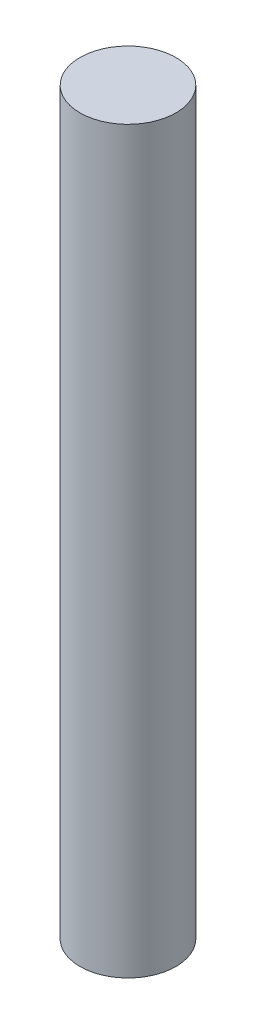
ISO-10303-21;
HEADER;
FILE_DESCRIPTION(('STEP AP214'),'2;1');
FILE_NAME('part.step','',(''),(''),'','','');
FILE_SCHEMA(('AUTOMOTIVE_DESIGN { 1 0 10303 214 1 1 1 1 }'));
ENDSEC;
DATA;
#1=APPLICATION_CONTEXT('core data for automotive mechanical design processes');
#2=APPLICATION_PROTOCOL_DEFINITION('international standard','automotive_design',2000,#1);
#3=PRODUCT_CONTEXT('',#1,'mechanical');
#4=PRODUCT('Part','Part','',(#3));
#5=PRODUCT_RELATED_PRODUCT_CATEGORY('part','',(#4));
#6=PRODUCT_DEFINITION_FORMATION('','',#4);
#7=PRODUCT_DEFINITION_CONTEXT('part definition',#1,'design');
#8=PRODUCT_DEFINITION('design','',#6,#7);
#9=PRODUCT_DEFINITION_SHAPE('','',#8);
#10=(LENGTH_UNIT() NAMED_UNIT(*) SI_UNIT(.MILLI.,.METRE.));
#11=(NAMED_UNIT(*) PLANE_ANGLE_UNIT() SI_UNIT($,.RADIAN.));
#12=(NAMED_UNIT(*) SI_UNIT($,.STERADIAN.) SOLID_ANGLE_UNIT());
#13=UNCERTAINTY_MEASURE_WITH_UNIT(LENGTH_MEASURE(1.E-05),#10,'distance_accuracy_value','');
#14=(GEOMETRIC_REPRESENTATION_CONTEXT(3) GLOBAL_UNCERTAINTY_ASSIGNED_CONTEXT((#13)) GLOBAL_UNIT_ASSIGNED_CONTEXT((#10,
#11,#12)) REPRESENTATION_CONTEXT('',''));
#15=CARTESIAN_POINT('',(0.,0.,0.));
#16=DIRECTION('',(0.,0.,1.));
#17=DIRECTION('',(1.,0.,0.));
#18=AXIS2_PLACEMENT_3D('',#15,#16,#17);
#19=CARTESIAN_POINT('',(0.,73.2,0.));
#20=DIRECTION('',(0.,-1.,0.));
#21=DIRECTION('',(0.,0.,-1.));
#22=AXIS2_PLACEMENT_3D('',#19,#20,#21);
#23=CYLINDRICAL_SURFACE('',#22,4.75);
#24=CARTESIAN_POINT('',(0.,73.2,0.));
#25=DIRECTION('',(0.,1.,0.));
#26=DIRECTION('',(0.,0.,1.));
#27=AXIS2_PLACEMENT_3D('',#24,#25,#26);
#28=CIRCLE('',#27,4.75);
#29=CARTESIAN_POINT('',(0.,73.2,4.75));
#30=VERTEX_POINT('',#29);
#31=EDGE_CURVE('E10',#30,#30,#28,.T.);
#32=ORIENTED_EDGE('',*,*,#31,.F.);
#33=EDGE_LOOP('',(#32));
#34=FACE_BOUND('',#33,.T.);
#35=CARTESIAN_POINT('',(0.,0.,0.));
#36=DIRECTION('',(0.,1.,0.));
#37=DIRECTION('',(0.,0.,1.));
#38=AXIS2_PLACEMENT_3D('',#35,#36,#37);
#39=CIRCLE('',#38,4.75);
#40=CARTESIAN_POINT('',(0.,0.,4.75));
#41=VERTEX_POINT('',#40);
#42=EDGE_CURVE('E33',#41,#41,#39,.T.);
#43=ORIENTED_EDGE('',*,*,#42,.T.);
#44=EDGE_LOOP('',(#43));
#45=FACE_BOUND('',#44,.T.);
#46=ADVANCED_FACE('F30',(#34,#45),#23,.T.);
#47=CARTESIAN_POINT('',(0.,73.2,0.));
#48=DIRECTION('',(0.,1.,0.));
#49=DIRECTION('',(0.,0.,1.));
#50=AXIS2_PLACEMENT_3D('',#47,#48,#49);
#51=PLANE('',#50);
#52=ORIENTED_EDGE('',*,*,#31,.T.);
#53=EDGE_LOOP('',(#52));
#54=FACE_BOUND('',#53,.T.);
#55=ADVANCED_FACE('F45',(#54),#51,.T.);
#56=CARTESIAN_POINT('',(0.,0.,0.));
#57=DIRECTION('',(0.,1.,0.));
#58=DIRECTION('',(0.,0.,1.));
#59=AXIS2_PLACEMENT_3D('',#56,#57,#58);
#60=PLANE('',#59);
#61=ORIENTED_EDGE('',*,*,#42,.F.);
#62=EDGE_LOOP('',(#61));
#63=FACE_BOUND('',#62,.T.);
#64=ADVANCED_FACE('F43',(#63),#60,.F.);
#65=CLOSED_SHELL('',(#46,#55,#64));
#66=MANIFOLD_SOLID_BREP('B2',#65);
#67=ADVANCED_BREP_SHAPE_REPRESENTATION('',(#18,#66),#14);
#68=SHAPE_DEFINITION_REPRESENTATION(#9,#67);
ENDSEC;
END-ISO-10303-21;
